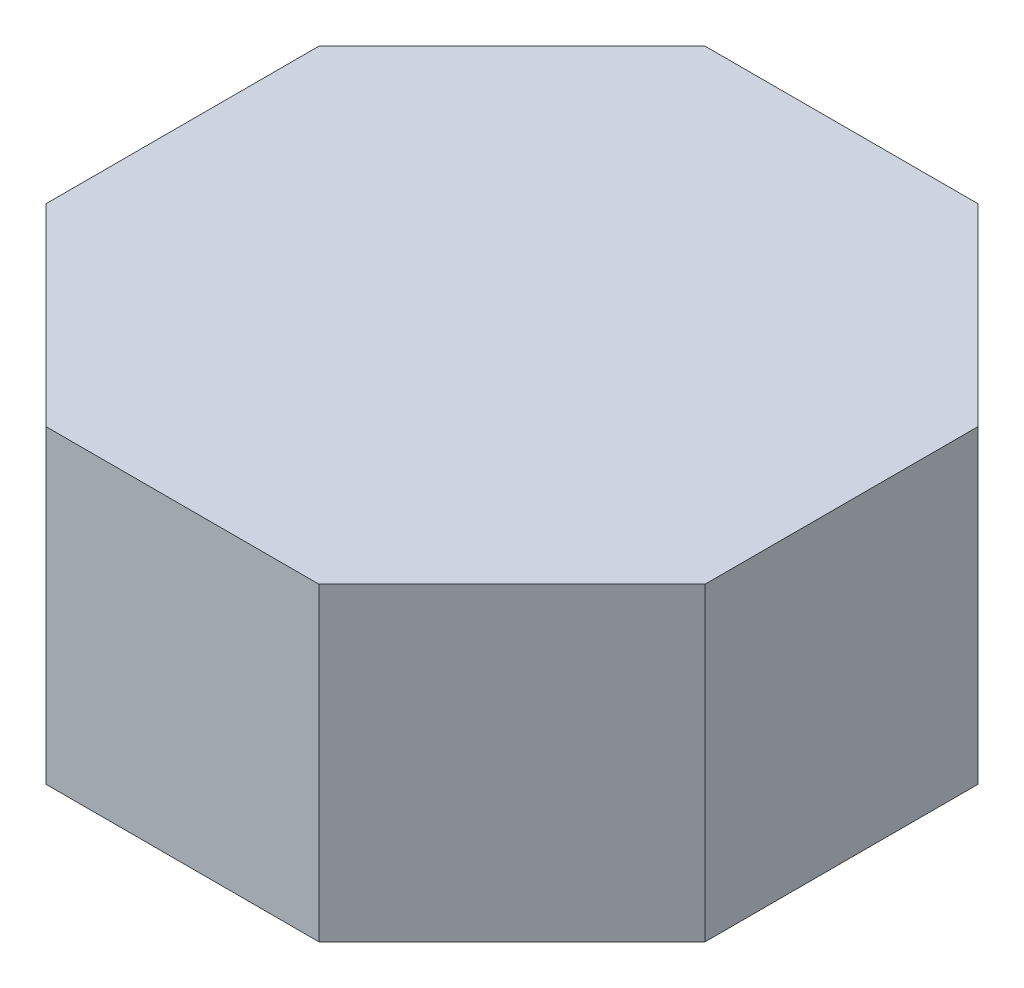
ISO-10303-21;
HEADER;
FILE_DESCRIPTION(('STEP AP214'),'2;1');
FILE_NAME('part.step','',(''),(''),'','','');
FILE_SCHEMA(('AUTOMOTIVE_DESIGN { 1 0 10303 214 1 1 1 1 }'));
ENDSEC;
DATA;
#1=APPLICATION_CONTEXT('core data for automotive mechanical design processes');
#2=APPLICATION_PROTOCOL_DEFINITION('international standard','automotive_design',2000,#1);
#3=PRODUCT_CONTEXT('',#1,'mechanical');
#4=PRODUCT('Part','Part','',(#3));
#5=PRODUCT_RELATED_PRODUCT_CATEGORY('part','',(#4));
#6=PRODUCT_DEFINITION_FORMATION('','',#4);
#7=PRODUCT_DEFINITION_CONTEXT('part definition',#1,'design');
#8=PRODUCT_DEFINITION('design','',#6,#7);
#9=PRODUCT_DEFINITION_SHAPE('','',#8);
#10=(LENGTH_UNIT() NAMED_UNIT(*) SI_UNIT(.MILLI.,.METRE.));
#11=(NAMED_UNIT(*) PLANE_ANGLE_UNIT() SI_UNIT($,.RADIAN.));
#12=(NAMED_UNIT(*) SI_UNIT($,.STERADIAN.) SOLID_ANGLE_UNIT());
#13=UNCERTAINTY_MEASURE_WITH_UNIT(LENGTH_MEASURE(1.E-05),#10,'distance_accuracy_value','');
#14=(GEOMETRIC_REPRESENTATION_CONTEXT(3) GLOBAL_UNCERTAINTY_ASSIGNED_CONTEXT((#13)) GLOBAL_UNIT_ASSIGNED_CONTEXT((#10,
#11,#12)) REPRESENTATION_CONTEXT('',''));
#15=CARTESIAN_POINT('',(0.,0.,0.));
#16=DIRECTION('',(0.,0.,1.));
#17=DIRECTION('',(1.,0.,0.));
#18=AXIS2_PLACEMENT_3D('',#15,#16,#17);
#19=CARTESIAN_POINT('',(-2.,1.88,0.82842712474619));
#20=DIRECTION('',(1.,0.,0.));
#21=DIRECTION('',(0.,0.,-1.));
#22=AXIS2_PLACEMENT_3D('',#19,#20,#21);
#23=PLANE('',#22);
#24=DIRECTION('',(0.,0.,1.));
#25=VECTOR('',#24,1.);
#26=CARTESIAN_POINT('',(-2.,0.,0.82842712474619));
#27=LINE('',#26,#25);
#28=CARTESIAN_POINT('',(-2.,0.,-0.82842712474619));
#29=VERTEX_POINT('',#28);
#30=CARTESIAN_POINT('',(-2.,0.,0.82842712474619));
#31=VERTEX_POINT('',#30);
#32=EDGE_CURVE('E434',#29,#31,#27,.T.);
#33=ORIENTED_EDGE('',*,*,#32,.T.);
#34=DIRECTION('',(0.,-1.,0.));
#35=VECTOR('',#34,1.);
#36=CARTESIAN_POINT('',(-2.,1.88,0.82842712474619));
#37=LINE('',#36,#35);
#38=CARTESIAN_POINT('',(-2.,1.88,0.82842712474619));
#39=VERTEX_POINT('',#38);
#40=EDGE_CURVE('E11',#39,#31,#37,.T.);
#41=ORIENTED_EDGE('',*,*,#40,.F.);
#42=DIRECTION('',(0.,0.,1.));
#43=VECTOR('',#42,1.);
#44=CARTESIAN_POINT('',(-2.,1.88,0.82842712474619));
#45=LINE('',#44,#43);
#46=CARTESIAN_POINT('',(-2.,1.88,-0.82842712474619));
#47=VERTEX_POINT('',#46);
#48=EDGE_CURVE('E461',#47,#39,#45,.T.);
#49=ORIENTED_EDGE('',*,*,#48,.F.);
#50=DIRECTION('',(0.,-1.,0.));
#51=VECTOR('',#50,1.);
#52=CARTESIAN_POINT('',(-2.,1.88,-0.82842712474619));
#53=LINE('',#52,#51);
#54=EDGE_CURVE('E447',#47,#29,#53,.T.);
#55=ORIENTED_EDGE('',*,*,#54,.T.);
#56=EDGE_LOOP('',(#33,#41,#49,#55));
#57=FACE_BOUND('',#56,.T.);
#58=ADVANCED_FACE('F366',(#57),#23,.F.);
#59=CARTESIAN_POINT('',(-0.82842712474619,1.88,2.));
#60=DIRECTION('',(0.707106781186548,0.,-0.707106781186548));
#61=DIRECTION('',(-0.707106781186548,0.,-0.707106781186548));
#62=AXIS2_PLACEMENT_3D('',#59,#60,#61);
#63=PLANE('',#62);
#64=DIRECTION('',(0.707106781186547,0.,0.707106781186547));
#65=VECTOR('',#64,1.);
#66=CARTESIAN_POINT('',(-0.82842712474619,0.,2.));
#67=LINE('',#66,#65);
#68=CARTESIAN_POINT('',(-0.82842712474619,0.,2.));
#69=VERTEX_POINT('',#68);
#70=EDGE_CURVE('E430',#31,#69,#67,.T.);
#71=ORIENTED_EDGE('',*,*,#70,.T.);
#72=DIRECTION('',(0.,-1.,0.));
#73=VECTOR('',#72,1.);
#74=CARTESIAN_POINT('',(-0.82842712474619,1.88,2.));
#75=LINE('',#74,#73);
#76=CARTESIAN_POINT('',(-0.82842712474619,1.88,2.));
#77=VERTEX_POINT('',#76);
#78=EDGE_CURVE('E373',#77,#69,#75,.T.);
#79=ORIENTED_EDGE('',*,*,#78,.F.);
#80=DIRECTION('',(0.707106781186547,0.,0.707106781186547));
#81=VECTOR('',#80,1.);
#82=CARTESIAN_POINT('',(-0.82842712474619,1.88,2.));
#83=LINE('',#82,#81);
#84=EDGE_CURVE('E443',#39,#77,#83,.T.);
#85=ORIENTED_EDGE('',*,*,#84,.F.);
#86=ORIENTED_EDGE('',*,*,#40,.T.);
#87=EDGE_LOOP('',(#71,#79,#85,#86));
#88=FACE_BOUND('',#87,.T.);
#89=ADVANCED_FACE('F442',(#88),#63,.F.);
#90=CARTESIAN_POINT('',(0.82842712474619,1.88,2.));
#91=DIRECTION('',(0.,0.,-1.));
#92=DIRECTION('',(-1.,0.,0.));
#93=AXIS2_PLACEMENT_3D('',#90,#91,#92);
#94=PLANE('',#93);
#95=DIRECTION('',(1.,0.,0.));
#96=VECTOR('',#95,1.);
#97=CARTESIAN_POINT('',(0.82842712474619,0.,2.));
#98=LINE('',#97,#96);
#99=CARTESIAN_POINT('',(0.82842712474619,0.,2.));
#100=VERTEX_POINT('',#99);
#101=EDGE_CURVE('E436',#69,#100,#98,.T.);
#102=ORIENTED_EDGE('',*,*,#101,.T.);
#103=DIRECTION('',(0.,-1.,0.));
#104=VECTOR('',#103,1.);
#105=CARTESIAN_POINT('',(0.82842712474619,1.88,2.));
#106=LINE('',#105,#104);
#107=CARTESIAN_POINT('',(0.82842712474619,1.88,2.));
#108=VERTEX_POINT('',#107);
#109=EDGE_CURVE('E487',#108,#100,#106,.T.);
#110=ORIENTED_EDGE('',*,*,#109,.F.);
#111=DIRECTION('',(1.,0.,0.));
#112=VECTOR('',#111,1.);
#113=CARTESIAN_POINT('',(0.82842712474619,1.88,2.));
#114=LINE('',#113,#112);
#115=EDGE_CURVE('E464',#77,#108,#114,.T.);
#116=ORIENTED_EDGE('',*,*,#115,.F.);
#117=ORIENTED_EDGE('',*,*,#78,.T.);
#118=EDGE_LOOP('',(#102,#110,#116,#117));
#119=FACE_BOUND('',#118,.T.);
#120=ADVANCED_FACE('F491',(#119),#94,.F.);
#121=CARTESIAN_POINT('',(2.,1.88,0.82842712474619));
#122=DIRECTION('',(-0.707106781186548,0.,-0.707106781186548));
#123=DIRECTION('',(-0.707106781186547,0.,0.707106781186548));
#124=AXIS2_PLACEMENT_3D('',#121,#122,#123);
#125=PLANE('',#124);
#126=DIRECTION('',(0.707106781186547,0.,-0.707106781186548));
#127=VECTOR('',#126,1.);
#128=CARTESIAN_POINT('',(2.,0.,0.82842712474619));
#129=LINE('',#128,#127);
#130=CARTESIAN_POINT('',(2.,0.,0.82842712474619));
#131=VERTEX_POINT('',#130);
#132=EDGE_CURVE('E451',#100,#131,#129,.T.);
#133=ORIENTED_EDGE('',*,*,#132,.T.);
#134=DIRECTION('',(0.,-1.,0.));
#135=VECTOR('',#134,1.);
#136=CARTESIAN_POINT('',(2.,1.88,0.82842712474619));
#137=LINE('',#136,#135);
#138=CARTESIAN_POINT('',(2.,1.88,0.82842712474619));
#139=VERTEX_POINT('',#138);
#140=EDGE_CURVE('E484',#139,#131,#137,.T.);
#141=ORIENTED_EDGE('',*,*,#140,.F.);
#142=DIRECTION('',(0.707106781186547,0.,-0.707106781186548));
#143=VECTOR('',#142,1.);
#144=CARTESIAN_POINT('',(2.,1.88,0.82842712474619));
#145=LINE('',#144,#143);
#146=EDGE_CURVE('E466',#108,#139,#145,.T.);
#147=ORIENTED_EDGE('',*,*,#146,.F.);
#148=ORIENTED_EDGE('',*,*,#109,.T.);
#149=EDGE_LOOP('',(#133,#141,#147,#148));
#150=FACE_BOUND('',#149,.T.);
#151=ADVANCED_FACE('F499',(#150),#125,.F.);
#152=CARTESIAN_POINT('',(2.,1.88,-0.82842712474619));
#153=DIRECTION('',(-1.,0.,0.));
#154=DIRECTION('',(0.,0.,1.));
#155=AXIS2_PLACEMENT_3D('',#152,#153,#154);
#156=PLANE('',#155);
#157=DIRECTION('',(0.,0.,-1.));
#158=VECTOR('',#157,1.);
#159=CARTESIAN_POINT('',(2.,0.,-0.82842712474619));
#160=LINE('',#159,#158);
#161=CARTESIAN_POINT('',(2.,0.,-0.82842712474619));
#162=VERTEX_POINT('',#161);
#163=EDGE_CURVE('E453',#131,#162,#160,.T.);
#164=ORIENTED_EDGE('',*,*,#163,.T.);
#165=DIRECTION('',(0.,-1.,0.));
#166=VECTOR('',#165,1.);
#167=CARTESIAN_POINT('',(2.,1.88,-0.82842712474619));
#168=LINE('',#167,#166);
#169=CARTESIAN_POINT('',(2.,1.88,-0.82842712474619));
#170=VERTEX_POINT('',#169);
#171=EDGE_CURVE('E481',#170,#162,#168,.T.);
#172=ORIENTED_EDGE('',*,*,#171,.F.);
#173=DIRECTION('',(0.,0.,-1.));
#174=VECTOR('',#173,1.);
#175=CARTESIAN_POINT('',(2.,1.88,-0.82842712474619));
#176=LINE('',#175,#174);
#177=EDGE_CURVE('E468',#139,#170,#176,.T.);
#178=ORIENTED_EDGE('',*,*,#177,.F.);
#179=ORIENTED_EDGE('',*,*,#140,.T.);
#180=EDGE_LOOP('',(#164,#172,#178,#179));
#181=FACE_BOUND('',#180,.T.);
#182=ADVANCED_FACE('F502',(#181),#156,.F.);
#183=CARTESIAN_POINT('',(0.82842712474619,1.88,-2.));
#184=DIRECTION('',(-0.707106781186548,0.,0.707106781186547));
#185=DIRECTION('',(0.707106781186547,0.,0.707106781186548));
#186=AXIS2_PLACEMENT_3D('',#183,#184,#185);
#187=PLANE('',#186);
#188=DIRECTION('',(-0.707106781186547,0.,-0.707106781186548));
#189=VECTOR('',#188,1.);
#190=CARTESIAN_POINT('',(0.82842712474619,0.,-2.));
#191=LINE('',#190,#189);
#192=CARTESIAN_POINT('',(0.82842712474619,0.,-2.));
#193=VERTEX_POINT('',#192);
#194=EDGE_CURVE('E455',#162,#193,#191,.T.);
#195=ORIENTED_EDGE('',*,*,#194,.T.);
#196=DIRECTION('',(0.,-1.,0.));
#197=VECTOR('',#196,1.);
#198=CARTESIAN_POINT('',(0.82842712474619,1.88,-2.));
#199=LINE('',#198,#197);
#200=CARTESIAN_POINT('',(0.82842712474619,1.88,-2.));
#201=VERTEX_POINT('',#200);
#202=EDGE_CURVE('E478',#201,#193,#199,.T.);
#203=ORIENTED_EDGE('',*,*,#202,.F.);
#204=DIRECTION('',(-0.707106781186547,0.,-0.707106781186548));
#205=VECTOR('',#204,1.);
#206=CARTESIAN_POINT('',(0.82842712474619,1.88,-2.));
#207=LINE('',#206,#205);
#208=EDGE_CURVE('E470',#170,#201,#207,.T.);
#209=ORIENTED_EDGE('',*,*,#208,.F.);
#210=ORIENTED_EDGE('',*,*,#171,.T.);
#211=EDGE_LOOP('',(#195,#203,#209,#210));
#212=FACE_BOUND('',#211,.T.);
#213=ADVANCED_FACE('F507',(#212),#187,.F.);
#214=CARTESIAN_POINT('',(-0.82842712474619,1.88,-2.));
#215=DIRECTION('',(0.,0.,1.));
#216=DIRECTION('',(1.,0.,0.));
#217=AXIS2_PLACEMENT_3D('',#214,#215,#216);
#218=PLANE('',#217);
#219=DIRECTION('',(-1.,0.,0.));
#220=VECTOR('',#219,1.);
#221=CARTESIAN_POINT('',(-0.82842712474619,0.,-2.));
#222=LINE('',#221,#220);
#223=CARTESIAN_POINT('',(-0.82842712474619,0.,-2.));
#224=VERTEX_POINT('',#223);
#225=EDGE_CURVE('E457',#193,#224,#222,.T.);
#226=ORIENTED_EDGE('',*,*,#225,.T.);
#227=DIRECTION('',(0.,-1.,0.));
#228=VECTOR('',#227,1.);
#229=CARTESIAN_POINT('',(-0.82842712474619,1.88,-2.));
#230=LINE('',#229,#228);
#231=CARTESIAN_POINT('',(-0.82842712474619,1.88,-2.));
#232=VERTEX_POINT('',#231);
#233=EDGE_CURVE('E475',#232,#224,#230,.T.);
#234=ORIENTED_EDGE('',*,*,#233,.F.);
#235=DIRECTION('',(-1.,0.,0.));
#236=VECTOR('',#235,1.);
#237=CARTESIAN_POINT('',(-0.82842712474619,1.88,-2.));
#238=LINE('',#237,#236);
#239=EDGE_CURVE('E385',#201,#232,#238,.T.);
#240=ORIENTED_EDGE('',*,*,#239,.F.);
#241=ORIENTED_EDGE('',*,*,#202,.T.);
#242=EDGE_LOOP('',(#226,#234,#240,#241));
#243=FACE_BOUND('',#242,.T.);
#244=ADVANCED_FACE('F510',(#243),#218,.F.);
#245=CARTESIAN_POINT('',(-2.,1.88,-0.82842712474619));
#246=DIRECTION('',(0.707106781186548,0.,0.707106781186548));
#247=DIRECTION('',(0.707106781186548,0.,-0.707106781186548));
#248=AXIS2_PLACEMENT_3D('',#245,#246,#247);
#249=PLANE('',#248);
#250=DIRECTION('',(-0.707106781186547,0.,0.707106781186547));
#251=VECTOR('',#250,1.);
#252=CARTESIAN_POINT('',(-2.,0.,-0.82842712474619));
#253=LINE('',#252,#251);
#254=EDGE_CURVE('E459',#224,#29,#253,.T.);
#255=ORIENTED_EDGE('',*,*,#254,.T.);
#256=ORIENTED_EDGE('',*,*,#54,.F.);
#257=DIRECTION('',(-0.707106781186547,0.,0.707106781186547));
#258=VECTOR('',#257,1.);
#259=CARTESIAN_POINT('',(-2.,1.88,-0.82842712474619));
#260=LINE('',#259,#258);
#261=EDGE_CURVE('E380',#232,#47,#260,.T.);
#262=ORIENTED_EDGE('',*,*,#261,.F.);
#263=ORIENTED_EDGE('',*,*,#233,.T.);
#264=EDGE_LOOP('',(#255,#256,#262,#263));
#265=FACE_BOUND('',#264,.T.);
#266=ADVANCED_FACE('F512',(#265),#249,.F.);
#267=CARTESIAN_POINT('',(-2.,1.88,-2.));
#268=DIRECTION('',(0.,-1.,0.));
#269=DIRECTION('',(0.,0.,-1.));
#270=AXIS2_PLACEMENT_3D('',#267,#268,#269);
#271=PLANE('',#270);
#272=ORIENTED_EDGE('',*,*,#48,.T.);
#273=ORIENTED_EDGE('',*,*,#84,.T.);
#274=ORIENTED_EDGE('',*,*,#115,.T.);
#275=ORIENTED_EDGE('',*,*,#146,.T.);
#276=ORIENTED_EDGE('',*,*,#177,.T.);
#277=ORIENTED_EDGE('',*,*,#208,.T.);
#278=ORIENTED_EDGE('',*,*,#239,.T.);
#279=ORIENTED_EDGE('',*,*,#261,.T.);
#280=EDGE_LOOP('',(#272,#273,#274,#275,#276,#277,#278,#279));
#281=FACE_BOUND('',#280,.T.);
#282=ADVANCED_FACE('F494',(#281),#271,.F.);
#283=CARTESIAN_POINT('',(-2.,0.,-2.));
#284=DIRECTION('',(0.,-1.,0.));
#285=DIRECTION('',(0.,0.,-1.));
#286=AXIS2_PLACEMENT_3D('',#283,#284,#285);
#287=PLANE('',#286);
#288=ORIENTED_EDGE('',*,*,#32,.F.);
#289=ORIENTED_EDGE('',*,*,#254,.F.);
#290=ORIENTED_EDGE('',*,*,#225,.F.);
#291=ORIENTED_EDGE('',*,*,#194,.F.);
#292=ORIENTED_EDGE('',*,*,#163,.F.);
#293=ORIENTED_EDGE('',*,*,#132,.F.);
#294=ORIENTED_EDGE('',*,*,#101,.F.);
#295=ORIENTED_EDGE('',*,*,#70,.F.);
#296=EDGE_LOOP('',(#288,#289,#290,#291,#292,#293,#294,#295));
#297=FACE_BOUND('',#296,.T.);
#298=ADVANCED_FACE('F431',(#297),#287,.T.);
#299=CLOSED_SHELL('',(#58,#89,#120,#151,#182,#213,#244,#266,#282,#298));
#300=MANIFOLD_SOLID_BREP('B2',#299);
#301=ADVANCED_BREP_SHAPE_REPRESENTATION('',(#18,#300),#14);
#302=SHAPE_DEFINITION_REPRESENTATION(#9,#301);
ENDSEC;
END-ISO-10303-21;
